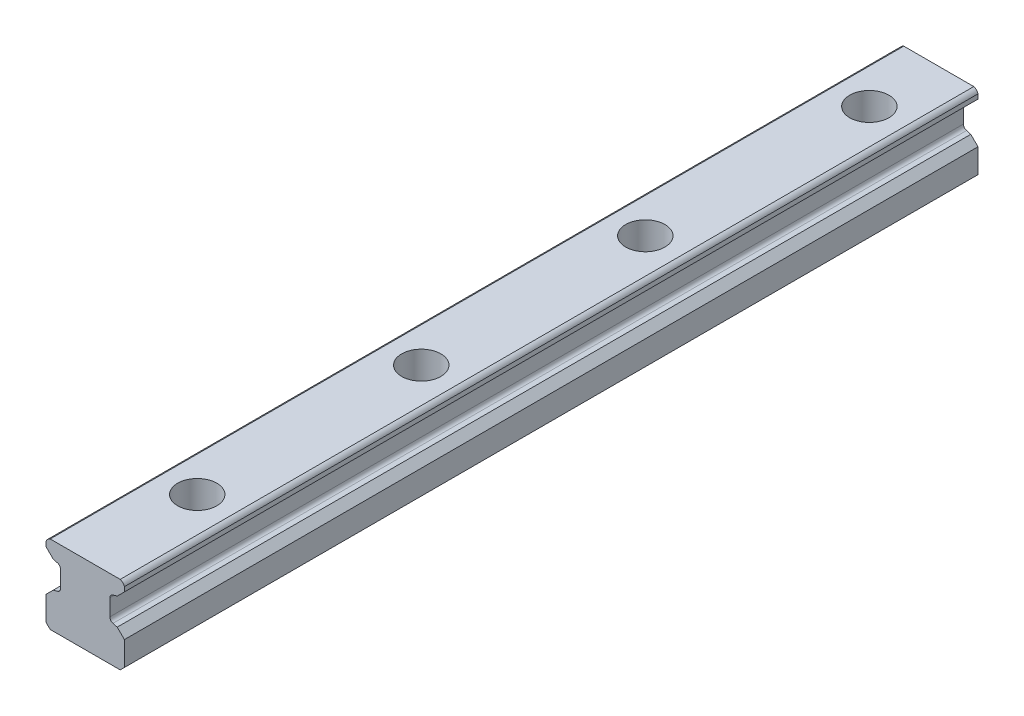
ISO-10303-21;
HEADER;
FILE_DESCRIPTION(('STEP AP214'),'2;1');
FILE_NAME('part.step','',(''),(''),'','','');
FILE_SCHEMA(('AUTOMOTIVE_DESIGN { 1 0 10303 214 1 1 1 1 }'));
ENDSEC;
DATA;
#1=APPLICATION_CONTEXT('core data for automotive mechanical design processes');
#2=APPLICATION_PROTOCOL_DEFINITION('international standard','automotive_design',2000,#1);
#3=PRODUCT_CONTEXT('',#1,'mechanical');
#4=PRODUCT('Part','Part','',(#3));
#5=PRODUCT_RELATED_PRODUCT_CATEGORY('part','',(#4));
#6=PRODUCT_DEFINITION_FORMATION('','',#4);
#7=PRODUCT_DEFINITION_CONTEXT('part definition',#1,'design');
#8=PRODUCT_DEFINITION('design','',#6,#7);
#9=PRODUCT_DEFINITION_SHAPE('','',#8);
#10=(LENGTH_UNIT() NAMED_UNIT(*) SI_UNIT(.MILLI.,.METRE.));
#11=(NAMED_UNIT(*) PLANE_ANGLE_UNIT() SI_UNIT($,.RADIAN.));
#12=(NAMED_UNIT(*) SI_UNIT($,.STERADIAN.) SOLID_ANGLE_UNIT());
#13=UNCERTAINTY_MEASURE_WITH_UNIT(LENGTH_MEASURE(1.E-05),#10,'distance_accuracy_value','');
#14=(GEOMETRIC_REPRESENTATION_CONTEXT(3) GLOBAL_UNCERTAINTY_ASSIGNED_CONTEXT((#13)) GLOBAL_UNIT_ASSIGNED_CONTEXT((#10,
#11,#12)) REPRESENTATION_CONTEXT('',''));
#15=CARTESIAN_POINT('',(0.,0.,0.));
#16=DIRECTION('',(0.,0.,1.));
#17=DIRECTION('',(1.,0.,0.));
#18=AXIS2_PLACEMENT_3D('',#15,#16,#17);
#19=CARTESIAN_POINT('',(-12.5,0.,760.));
#20=DIRECTION('',(0.,1.,0.));
#21=DIRECTION('',(-1.,0.,0.));
#22=AXIS2_PLACEMENT_3D('',#19,#20,#21);
#23=PLANE('',#22);
#24=CARTESIAN_POINT('',(0.,0.,480.));
#25=DIRECTION('',(0.,1.,0.));
#26=DIRECTION('',(0.,0.,1.));
#27=AXIS2_PLACEMENT_3D('',#24,#25,#26);
#28=CIRCLE('',#27,4.49999999999995);
#29=CARTESIAN_POINT('',(0.,0.,484.5));
#30=VERTEX_POINT('',#29);
#31=EDGE_CURVE('E324',#30,#30,#28,.T.);
#32=ORIENTED_EDGE('',*,*,#31,.T.);
#33=EDGE_LOOP('',(#32));
#34=FACE_BOUND('',#33,.T.);
#35=CARTESIAN_POINT('',(0.,0.,560.));
#36=DIRECTION('',(0.,1.,0.));
#37=DIRECTION('',(0.,0.,1.));
#38=AXIS2_PLACEMENT_3D('',#35,#36,#37);
#39=CIRCLE('',#38,4.49999999999995);
#40=CARTESIAN_POINT('',(0.,0.,564.5));
#41=VERTEX_POINT('',#40);
#42=EDGE_CURVE('E336',#41,#41,#39,.T.);
#43=ORIENTED_EDGE('',*,*,#42,.T.);
#44=EDGE_LOOP('',(#43));
#45=FACE_BOUND('',#44,.T.);
#46=CARTESIAN_POINT('',(0.,0.,640.));
#47=DIRECTION('',(0.,1.,0.));
#48=DIRECTION('',(0.,0.,1.));
#49=AXIS2_PLACEMENT_3D('',#46,#47,#48);
#50=CIRCLE('',#49,4.49999999999995);
#51=CARTESIAN_POINT('',(0.,0.,644.5));
#52=VERTEX_POINT('',#51);
#53=EDGE_CURVE('E348',#52,#52,#50,.T.);
#54=ORIENTED_EDGE('',*,*,#53,.T.);
#55=EDGE_LOOP('',(#54));
#56=FACE_BOUND('',#55,.T.);
#57=CARTESIAN_POINT('',(0.,0.,720.));
#58=DIRECTION('',(0.,1.,0.));
#59=DIRECTION('',(0.,0.,1.));
#60=AXIS2_PLACEMENT_3D('',#57,#58,#59);
#61=CIRCLE('',#60,4.49999999999995);
#62=CARTESIAN_POINT('',(0.,0.,724.5));
#63=VERTEX_POINT('',#62);
#64=EDGE_CURVE('E360',#63,#63,#61,.T.);
#65=ORIENTED_EDGE('',*,*,#64,.T.);
#66=EDGE_LOOP('',(#65));
#67=FACE_BOUND('',#66,.T.);
#68=DIRECTION('',(-1.,0.,0.));
#69=VECTOR('',#68,1.);
#70=CARTESIAN_POINT('',(-12.5,0.,455.2));
#71=LINE('',#70,#69);
#72=CARTESIAN_POINT('',(12.5,0.,455.2));
#73=VERTEX_POINT('',#72);
#74=CARTESIAN_POINT('',(-12.5,0.,455.2));
#75=VERTEX_POINT('',#74);
#76=EDGE_CURVE('E316',#73,#75,#71,.T.);
#77=ORIENTED_EDGE('',*,*,#76,.F.);
#78=DIRECTION('',(0.,0.,-1.));
#79=VECTOR('',#78,1.);
#80=CARTESIAN_POINT('',(12.5,0.,760.));
#81=LINE('',#80,#79);
#82=CARTESIAN_POINT('',(12.5,0.,760.));
#83=VERTEX_POINT('',#82);
#84=EDGE_CURVE('E260',#83,#73,#81,.T.);
#85=ORIENTED_EDGE('',*,*,#84,.F.);
#86=DIRECTION('',(1.,0.,0.));
#87=VECTOR('',#86,1.);
#88=CARTESIAN_POINT('',(-12.5,0.,760.));
#89=LINE('',#88,#87);
#90=CARTESIAN_POINT('',(-12.5,0.,760.));
#91=VERTEX_POINT('',#90);
#92=EDGE_CURVE('E380',#91,#83,#89,.T.);
#93=ORIENTED_EDGE('',*,*,#92,.F.);
#94=DIRECTION('',(0.,0.,-1.));
#95=VECTOR('',#94,1.);
#96=CARTESIAN_POINT('',(-12.5,0.,760.));
#97=LINE('',#96,#95);
#98=EDGE_CURVE('E263',#91,#75,#97,.T.);
#99=ORIENTED_EDGE('',*,*,#98,.T.);
#100=EDGE_LOOP('',(#77,#85,#93,#99));
#101=FACE_BOUND('',#100,.T.);
#102=ADVANCED_FACE('F33',(#34,#45,#56,#67,#101),#23,.F.);
#103=CARTESIAN_POINT('',(12.5,28.,760.));
#104=DIRECTION('',(0.,-1.,0.));
#105=DIRECTION('',(1.,0.,0.));
#106=AXIS2_PLACEMENT_3D('',#103,#104,#105);
#107=PLANE('',#106);
#108=CARTESIAN_POINT('',(0.,28.,480.));
#109=DIRECTION('',(0.,1.,0.));
#110=DIRECTION('',(0.,0.,1.));
#111=AXIS2_PLACEMENT_3D('',#108,#109,#110);
#112=CIRCLE('',#111,7.00000000000001);
#113=CARTESIAN_POINT('',(0.,28.,487.));
#114=VERTEX_POINT('',#113);
#115=EDGE_CURVE('E333',#114,#114,#112,.T.);
#116=ORIENTED_EDGE('',*,*,#115,.F.);
#117=EDGE_LOOP('',(#116));
#118=FACE_BOUND('',#117,.T.);
#119=CARTESIAN_POINT('',(0.,28.,560.));
#120=DIRECTION('',(0.,1.,0.));
#121=DIRECTION('',(0.,0.,1.));
#122=AXIS2_PLACEMENT_3D('',#119,#120,#121);
#123=CIRCLE('',#122,7.00000000000001);
#124=CARTESIAN_POINT('',(0.,28.,567.));
#125=VERTEX_POINT('',#124);
#126=EDGE_CURVE('E345',#125,#125,#123,.T.);
#127=ORIENTED_EDGE('',*,*,#126,.F.);
#128=EDGE_LOOP('',(#127));
#129=FACE_BOUND('',#128,.T.);
#130=CARTESIAN_POINT('',(0.,28.,640.));
#131=DIRECTION('',(0.,1.,0.));
#132=DIRECTION('',(0.,0.,1.));
#133=AXIS2_PLACEMENT_3D('',#130,#131,#132);
#134=CIRCLE('',#133,7.00000000000001);
#135=CARTESIAN_POINT('',(0.,28.,647.));
#136=VERTEX_POINT('',#135);
#137=EDGE_CURVE('E357',#136,#136,#134,.T.);
#138=ORIENTED_EDGE('',*,*,#137,.F.);
#139=EDGE_LOOP('',(#138));
#140=FACE_BOUND('',#139,.T.);
#141=CARTESIAN_POINT('',(0.,28.,720.));
#142=DIRECTION('',(0.,1.,0.));
#143=DIRECTION('',(0.,0.,1.));
#144=AXIS2_PLACEMENT_3D('',#141,#142,#143);
#145=CIRCLE('',#144,7.00000000000001);
#146=CARTESIAN_POINT('',(0.,28.,727.));
#147=VERTEX_POINT('',#146);
#148=EDGE_CURVE('E369',#147,#147,#145,.T.);
#149=ORIENTED_EDGE('',*,*,#148,.F.);
#150=EDGE_LOOP('',(#149));
#151=FACE_BOUND('',#150,.T.);
#152=DIRECTION('',(1.,0.,0.));
#153=VECTOR('',#152,1.);
#154=CARTESIAN_POINT('',(12.5,28.,455.2));
#155=LINE('',#154,#153);
#156=CARTESIAN_POINT('',(-12.5,28.,455.2));
#157=VERTEX_POINT('',#156);
#158=CARTESIAN_POINT('',(12.5,28.,455.2));
#159=VERTEX_POINT('',#158);
#160=EDGE_CURVE('E285',#157,#159,#155,.T.);
#161=ORIENTED_EDGE('',*,*,#160,.F.);
#162=DIRECTION('',(0.,0.,-1.));
#163=VECTOR('',#162,1.);
#164=CARTESIAN_POINT('',(-12.5,28.,760.));
#165=LINE('',#164,#163);
#166=CARTESIAN_POINT('',(-12.5,28.,760.));
#167=VERTEX_POINT('',#166);
#168=EDGE_CURVE('E224',#167,#157,#165,.T.);
#169=ORIENTED_EDGE('',*,*,#168,.F.);
#170=DIRECTION('',(-1.,0.,0.));
#171=VECTOR('',#170,1.);
#172=CARTESIAN_POINT('',(12.5,28.,760.));
#173=LINE('',#172,#171);
#174=CARTESIAN_POINT('',(12.5,28.,760.));
#175=VERTEX_POINT('',#174);
#176=EDGE_CURVE('E404',#175,#167,#173,.T.);
#177=ORIENTED_EDGE('',*,*,#176,.F.);
#178=DIRECTION('',(0.,0.,-1.));
#179=VECTOR('',#178,1.);
#180=CARTESIAN_POINT('',(12.5,28.,760.));
#181=LINE('',#180,#179);
#182=EDGE_CURVE('E227',#175,#159,#181,.T.);
#183=ORIENTED_EDGE('',*,*,#182,.T.);
#184=EDGE_LOOP('',(#161,#169,#177,#183));
#185=FACE_BOUND('',#184,.T.);
#186=ADVANCED_FACE('F441',(#118,#129,#140,#151,#185),#107,.F.);
#187=CARTESIAN_POINT('',(-10.3,14.5556968580623,760.));
#188=DIRECTION('',(0.,0.,-1.));
#189=DIRECTION('',(-1.,0.,0.));
#190=AXIS2_PLACEMENT_3D('',#187,#188,#189);
#191=CYLINDRICAL_SURFACE('',#190,1.5);
#192=CARTESIAN_POINT('',(-10.3,14.5556968580623,455.2));
#193=DIRECTION('',(0.,0.,-1.));
#194=DIRECTION('',(-1.,0.,0.));
#195=AXIS2_PLACEMENT_3D('',#192,#193,#194);
#196=CIRCLE('',#195,1.5);
#197=CARTESIAN_POINT('',(-9.91177143234622,13.1068081186287,455.2));
#198=VERTEX_POINT('',#197);
#199=CARTESIAN_POINT('',(-8.8,14.5556968580623,455.2));
#200=VERTEX_POINT('',#199);
#201=EDGE_CURVE('E47',#198,#200,#196,.F.);
#202=ORIENTED_EDGE('',*,*,#201,.F.);
#203=DIRECTION('',(0.,0.,-1.));
#204=VECTOR('',#203,1.);
#205=CARTESIAN_POINT('',(-9.91177143234622,13.1068081186287,760.));
#206=LINE('',#205,#204);
#207=CARTESIAN_POINT('',(-9.91177143234622,13.1068081186287,760.));
#208=VERTEX_POINT('',#207);
#209=EDGE_CURVE('E41',#208,#198,#206,.T.);
#210=ORIENTED_EDGE('',*,*,#209,.F.);
#211=CARTESIAN_POINT('',(-10.3,14.5556968580623,760.));
#212=DIRECTION('',(0.,0.,-1.));
#213=DIRECTION('',(1.,0.,0.));
#214=AXIS2_PLACEMENT_3D('',#211,#212,#213);
#215=CIRCLE('',#214,1.5);
#216=CARTESIAN_POINT('',(-8.8,14.5556968580623,760.));
#217=VERTEX_POINT('',#216);
#218=EDGE_CURVE('E284',#217,#208,#215,.T.);
#219=ORIENTED_EDGE('',*,*,#218,.F.);
#220=DIRECTION('',(0.,0.,-1.));
#221=VECTOR('',#220,1.);
#222=CARTESIAN_POINT('',(-8.8,14.5556968580623,760.));
#223=LINE('',#222,#221);
#224=EDGE_CURVE('E209',#217,#200,#223,.T.);
#225=ORIENTED_EDGE('',*,*,#224,.T.);
#226=EDGE_LOOP('',(#202,#210,#219,#225));
#227=FACE_BOUND('',#226,.T.);
#228=ADVANCED_FACE('F35',(#227),#191,.F.);
#229=CARTESIAN_POINT('',(-9.91177143234622,13.1068081186287,760.));
#230=DIRECTION('',(0.258819045102522,-0.965925826289068,0.));
#231=DIRECTION('',(0.965925826289068,0.258819045102522,0.));
#232=AXIS2_PLACEMENT_3D('',#229,#230,#231);
#233=PLANE('',#232);
#234=DIRECTION('',(0.965925826289068,0.258819045102522,0.));
#235=VECTOR('',#234,1.);
#236=CARTESIAN_POINT('',(-9.91177143234622,13.1068081186287,455.2));
#237=LINE('',#236,#235);
#238=CARTESIAN_POINT('',(-11.43,12.7,455.2));
#239=VERTEX_POINT('',#238);
#240=EDGE_CURVE('E280',#239,#198,#237,.T.);
#241=ORIENTED_EDGE('',*,*,#240,.F.);
#242=DIRECTION('',(0.,0.,-1.));
#243=VECTOR('',#242,1.);
#244=CARTESIAN_POINT('',(-11.43,12.7,760.));
#245=LINE('',#244,#243);
#246=CARTESIAN_POINT('',(-11.43,12.7,760.));
#247=VERTEX_POINT('',#246);
#248=EDGE_CURVE('E272',#247,#239,#245,.T.);
#249=ORIENTED_EDGE('',*,*,#248,.F.);
#250=DIRECTION('',(-0.965925826289068,-0.258819045102522,0.));
#251=VECTOR('',#250,1.);
#252=CARTESIAN_POINT('',(-9.91177143234622,13.1068081186287,760.));
#253=LINE('',#252,#251);
#254=EDGE_CURVE('E281',#208,#247,#253,.T.);
#255=ORIENTED_EDGE('',*,*,#254,.F.);
#256=ORIENTED_EDGE('',*,*,#209,.T.);
#257=EDGE_LOOP('',(#241,#249,#255,#256));
#258=FACE_BOUND('',#257,.T.);
#259=ADVANCED_FACE('F278',(#258),#233,.F.);
#260=CARTESIAN_POINT('',(-11.43,12.7,760.));
#261=DIRECTION('',(0.707106781186549,-0.707106781186546,0.));
#262=DIRECTION('',(0.707106781186546,0.707106781186549,0.));
#263=AXIS2_PLACEMENT_3D('',#260,#261,#262);
#264=PLANE('',#263);
#265=DIRECTION('',(0.707106781186546,0.707106781186549,0.));
#266=VECTOR('',#265,1.);
#267=CARTESIAN_POINT('',(-11.43,12.7,455.2));
#268=LINE('',#267,#266);
#269=CARTESIAN_POINT('',(-14.,10.13,455.2));
#270=VERTEX_POINT('',#269);
#271=EDGE_CURVE('E322',#270,#239,#268,.T.);
#272=ORIENTED_EDGE('',*,*,#271,.F.);
#273=DIRECTION('',(0.,0.,-1.));
#274=VECTOR('',#273,1.);
#275=CARTESIAN_POINT('',(-14.,10.13,760.));
#276=LINE('',#275,#274);
#277=CARTESIAN_POINT('',(-14.,10.13,760.));
#278=VERTEX_POINT('',#277);
#279=EDGE_CURVE('E269',#278,#270,#276,.T.);
#280=ORIENTED_EDGE('',*,*,#279,.F.);
#281=DIRECTION('',(-0.707106781186546,-0.707106781186549,0.));
#282=VECTOR('',#281,1.);
#283=CARTESIAN_POINT('',(-11.43,12.7,760.));
#284=LINE('',#283,#282);
#285=EDGE_CURVE('E374',#247,#278,#284,.T.);
#286=ORIENTED_EDGE('',*,*,#285,.F.);
#287=ORIENTED_EDGE('',*,*,#248,.T.);
#288=EDGE_LOOP('',(#272,#280,#286,#287));
#289=FACE_BOUND('',#288,.T.);
#290=ADVANCED_FACE('F512',(#289),#264,.F.);
#291=CARTESIAN_POINT('',(-14.,10.13,760.));
#292=DIRECTION('',(1.,0.,0.));
#293=DIRECTION('',(0.,1.,0.));
#294=AXIS2_PLACEMENT_3D('',#291,#292,#293);
#295=PLANE('',#294);
#296=DIRECTION('',(0.,1.,0.));
#297=VECTOR('',#296,1.);
#298=CARTESIAN_POINT('',(-14.,10.13,455.2));
#299=LINE('',#298,#297);
#300=CARTESIAN_POINT('',(-14.,1.5,455.2));
#301=VERTEX_POINT('',#300);
#302=EDGE_CURVE('E320',#301,#270,#299,.T.);
#303=ORIENTED_EDGE('',*,*,#302,.F.);
#304=DIRECTION('',(0.,0.,-1.));
#305=VECTOR('',#304,1.);
#306=CARTESIAN_POINT('',(-14.,1.5,760.));
#307=LINE('',#306,#305);
#308=CARTESIAN_POINT('',(-14.,1.5,760.));
#309=VERTEX_POINT('',#308);
#310=EDGE_CURVE('E266',#309,#301,#307,.T.);
#311=ORIENTED_EDGE('',*,*,#310,.F.);
#312=DIRECTION('',(0.,-1.,0.));
#313=VECTOR('',#312,1.);
#314=CARTESIAN_POINT('',(-14.,10.13,760.));
#315=LINE('',#314,#313);
#316=EDGE_CURVE('E376',#278,#309,#315,.T.);
#317=ORIENTED_EDGE('',*,*,#316,.F.);
#318=ORIENTED_EDGE('',*,*,#279,.T.);
#319=EDGE_LOOP('',(#303,#311,#317,#318));
#320=FACE_BOUND('',#319,.T.);
#321=ADVANCED_FACE('F508',(#320),#295,.F.);
#322=CARTESIAN_POINT('',(-14.,1.5,760.));
#323=DIRECTION('',(0.707106781186547,0.707106781186548,0.));
#324=DIRECTION('',(-0.707106781186548,0.707106781186547,0.));
#325=AXIS2_PLACEMENT_3D('',#322,#323,#324);
#326=PLANE('',#325);
#327=DIRECTION('',(-0.707106781186548,0.707106781186547,0.));
#328=VECTOR('',#327,1.);
#329=CARTESIAN_POINT('',(-14.,1.5,455.2));
#330=LINE('',#329,#328);
#331=EDGE_CURVE('E318',#75,#301,#330,.T.);
#332=ORIENTED_EDGE('',*,*,#331,.F.);
#333=ORIENTED_EDGE('',*,*,#98,.F.);
#334=DIRECTION('',(0.707106781186548,-0.707106781186547,0.));
#335=VECTOR('',#334,1.);
#336=CARTESIAN_POINT('',(-14.,1.5,760.));
#337=LINE('',#336,#335);
#338=EDGE_CURVE('E378',#309,#91,#337,.T.);
#339=ORIENTED_EDGE('',*,*,#338,.F.);
#340=ORIENTED_EDGE('',*,*,#310,.T.);
#341=EDGE_LOOP('',(#332,#333,#339,#340));
#342=FACE_BOUND('',#341,.T.);
#343=ADVANCED_FACE('F503',(#342),#326,.F.);
#344=CARTESIAN_POINT('',(12.5,0.,760.));
#345=DIRECTION('',(-0.707106781186548,0.707106781186547,0.));
#346=DIRECTION('',(-0.707106781186547,-0.707106781186548,0.));
#347=AXIS2_PLACEMENT_3D('',#344,#345,#346);
#348=PLANE('',#347);
#349=DIRECTION('',(-0.707106781186547,-0.707106781186548,0.));
#350=VECTOR('',#349,1.);
#351=CARTESIAN_POINT('',(12.5,0.,455.2));
#352=LINE('',#351,#350);
#353=CARTESIAN_POINT('',(14.,1.5,455.2));
#354=VERTEX_POINT('',#353);
#355=EDGE_CURVE('E313',#354,#73,#352,.T.);
#356=ORIENTED_EDGE('',*,*,#355,.F.);
#357=DIRECTION('',(0.,0.,-1.));
#358=VECTOR('',#357,1.);
#359=CARTESIAN_POINT('',(14.,1.5,760.));
#360=LINE('',#359,#358);
#361=CARTESIAN_POINT('',(14.,1.5,760.));
#362=VERTEX_POINT('',#361);
#363=EDGE_CURVE('E257',#362,#354,#360,.T.);
#364=ORIENTED_EDGE('',*,*,#363,.F.);
#365=DIRECTION('',(0.707106781186547,0.707106781186548,0.));
#366=VECTOR('',#365,1.);
#367=CARTESIAN_POINT('',(12.5,0.,760.));
#368=LINE('',#367,#366);
#369=EDGE_CURVE('E382',#83,#362,#368,.T.);
#370=ORIENTED_EDGE('',*,*,#369,.F.);
#371=ORIENTED_EDGE('',*,*,#84,.T.);
#372=EDGE_LOOP('',(#356,#364,#370,#371));
#373=FACE_BOUND('',#372,.T.);
#374=ADVANCED_FACE('F494',(#373),#348,.F.);
#375=CARTESIAN_POINT('',(14.,1.5,760.));
#376=DIRECTION('',(-1.,0.,0.));
#377=DIRECTION('',(0.,-1.,0.));
#378=AXIS2_PLACEMENT_3D('',#375,#376,#377);
#379=PLANE('',#378);
#380=DIRECTION('',(0.,-1.,0.));
#381=VECTOR('',#380,1.);
#382=CARTESIAN_POINT('',(14.,1.5,455.2));
#383=LINE('',#382,#381);
#384=CARTESIAN_POINT('',(14.,10.13,455.2));
#385=VERTEX_POINT('',#384);
#386=EDGE_CURVE('E311',#385,#354,#383,.T.);
#387=ORIENTED_EDGE('',*,*,#386,.F.);
#388=DIRECTION('',(0.,0.,-1.));
#389=VECTOR('',#388,1.);
#390=CARTESIAN_POINT('',(14.,10.13,760.));
#391=LINE('',#390,#389);
#392=CARTESIAN_POINT('',(14.,10.13,760.));
#393=VERTEX_POINT('',#392);
#394=EDGE_CURVE('E254',#393,#385,#391,.T.);
#395=ORIENTED_EDGE('',*,*,#394,.F.);
#396=DIRECTION('',(0.,1.,0.));
#397=VECTOR('',#396,1.);
#398=CARTESIAN_POINT('',(14.,1.5,760.));
#399=LINE('',#398,#397);
#400=EDGE_CURVE('E384',#362,#393,#399,.T.);
#401=ORIENTED_EDGE('',*,*,#400,.F.);
#402=ORIENTED_EDGE('',*,*,#363,.T.);
#403=EDGE_LOOP('',(#387,#395,#401,#402));
#404=FACE_BOUND('',#403,.T.);
#405=ADVANCED_FACE('F489',(#404),#379,.F.);
#406=CARTESIAN_POINT('',(14.,10.13,760.));
#407=DIRECTION('',(-0.707106781186548,-0.707106781186548,0.));
#408=DIRECTION('',(0.707106781186548,-0.707106781186548,0.));
#409=AXIS2_PLACEMENT_3D('',#406,#407,#408);
#410=PLANE('',#409);
#411=DIRECTION('',(0.707106781186548,-0.707106781186548,0.));
#412=VECTOR('',#411,1.);
#413=CARTESIAN_POINT('',(14.,10.13,455.2));
#414=LINE('',#413,#412);
#415=CARTESIAN_POINT('',(11.43,12.7,455.2));
#416=VERTEX_POINT('',#415);
#417=EDGE_CURVE('E309',#416,#385,#414,.T.);
#418=ORIENTED_EDGE('',*,*,#417,.F.);
#419=DIRECTION('',(0.,0.,-1.));
#420=VECTOR('',#419,1.);
#421=CARTESIAN_POINT('',(11.43,12.7,760.));
#422=LINE('',#421,#420);
#423=CARTESIAN_POINT('',(11.43,12.7,760.));
#424=VERTEX_POINT('',#423);
#425=EDGE_CURVE('E251',#424,#416,#422,.T.);
#426=ORIENTED_EDGE('',*,*,#425,.F.);
#427=DIRECTION('',(-0.707106781186548,0.707106781186548,0.));
#428=VECTOR('',#427,1.);
#429=CARTESIAN_POINT('',(14.,10.13,760.));
#430=LINE('',#429,#428);
#431=EDGE_CURVE('E386',#393,#424,#430,.T.);
#432=ORIENTED_EDGE('',*,*,#431,.F.);
#433=ORIENTED_EDGE('',*,*,#394,.T.);
#434=EDGE_LOOP('',(#418,#426,#432,#433));
#435=FACE_BOUND('',#434,.T.);
#436=ADVANCED_FACE('F484',(#435),#410,.F.);
#437=CARTESIAN_POINT('',(11.43,12.7,760.));
#438=DIRECTION('',(-0.258819045102522,-0.965925826289068,0.));
#439=DIRECTION('',(0.965925826289068,-0.258819045102522,0.));
#440=AXIS2_PLACEMENT_3D('',#437,#438,#439);
#441=PLANE('',#440);
#442=DIRECTION('',(0.965925826289068,-0.258819045102522,0.));
#443=VECTOR('',#442,1.);
#444=CARTESIAN_POINT('',(11.43,12.7,455.2));
#445=LINE('',#444,#443);
#446=CARTESIAN_POINT('',(9.91177143234622,13.1068081186287,455.2));
#447=VERTEX_POINT('',#446);
#448=EDGE_CURVE('E307',#447,#416,#445,.T.);
#449=ORIENTED_EDGE('',*,*,#448,.F.);
#450=DIRECTION('',(0.,0.,-1.));
#451=VECTOR('',#450,1.);
#452=CARTESIAN_POINT('',(9.91177143234622,13.1068081186287,760.));
#453=LINE('',#452,#451);
#454=CARTESIAN_POINT('',(9.91177143234622,13.1068081186287,760.));
#455=VERTEX_POINT('',#454);
#456=EDGE_CURVE('E248',#455,#447,#453,.T.);
#457=ORIENTED_EDGE('',*,*,#456,.F.);
#458=DIRECTION('',(-0.965925826289068,0.258819045102522,0.));
#459=VECTOR('',#458,1.);
#460=CARTESIAN_POINT('',(11.43,12.7,760.));
#461=LINE('',#460,#459);
#462=EDGE_CURVE('E388',#424,#455,#461,.T.);
#463=ORIENTED_EDGE('',*,*,#462,.F.);
#464=ORIENTED_EDGE('',*,*,#425,.T.);
#465=EDGE_LOOP('',(#449,#457,#463,#464));
#466=FACE_BOUND('',#465,.T.);
#467=ADVANCED_FACE('F479',(#466),#441,.F.);
#468=CARTESIAN_POINT('',(10.3,14.5556968580623,760.));
#469=DIRECTION('',(0.,0.,-1.));
#470=DIRECTION('',(-1.,0.,0.));
#471=AXIS2_PLACEMENT_3D('',#468,#469,#470);
#472=CYLINDRICAL_SURFACE('',#471,1.5);
#473=CARTESIAN_POINT('',(10.3,14.5556968580623,455.2));
#474=DIRECTION('',(0.,0.,-1.));
#475=DIRECTION('',(-1.,0.,0.));
#476=AXIS2_PLACEMENT_3D('',#473,#474,#475);
#477=CIRCLE('',#476,1.5);
#478=CARTESIAN_POINT('',(8.8,14.5556968580623,455.2));
#479=VERTEX_POINT('',#478);
#480=EDGE_CURVE('E305',#479,#447,#477,.F.);
#481=ORIENTED_EDGE('',*,*,#480,.F.);
#482=DIRECTION('',(0.,0.,-1.));
#483=VECTOR('',#482,1.);
#484=CARTESIAN_POINT('',(8.8,14.5556968580623,760.));
#485=LINE('',#484,#483);
#486=CARTESIAN_POINT('',(8.8,14.5556968580623,760.));
#487=VERTEX_POINT('',#486);
#488=EDGE_CURVE('E245',#487,#479,#485,.T.);
#489=ORIENTED_EDGE('',*,*,#488,.F.);
#490=CARTESIAN_POINT('',(10.3,14.5556968580623,760.));
#491=DIRECTION('',(0.,0.,-1.));
#492=DIRECTION('',(1.,0.,0.));
#493=AXIS2_PLACEMENT_3D('',#490,#491,#492);
#494=CIRCLE('',#493,1.5);
#495=EDGE_CURVE('E390',#455,#487,#494,.T.);
#496=ORIENTED_EDGE('',*,*,#495,.F.);
#497=ORIENTED_EDGE('',*,*,#456,.T.);
#498=EDGE_LOOP('',(#481,#489,#496,#497));
#499=FACE_BOUND('',#498,.T.);
#500=ADVANCED_FACE('F474',(#499),#472,.F.);
#501=CARTESIAN_POINT('',(8.8,14.5556968580623,760.));
#502=DIRECTION('',(-1.,0.,0.));
#503=DIRECTION('',(0.,-1.,0.));
#504=AXIS2_PLACEMENT_3D('',#501,#502,#503);
#505=PLANE('',#504);
#506=DIRECTION('',(0.,-1.,0.));
#507=VECTOR('',#506,1.);
#508=CARTESIAN_POINT('',(8.8,14.5556968580623,455.2));
#509=LINE('',#508,#507);
#510=CARTESIAN_POINT('',(8.8,20.4443031419377,455.2));
#511=VERTEX_POINT('',#510);
#512=EDGE_CURVE('E303',#511,#479,#509,.T.);
#513=ORIENTED_EDGE('',*,*,#512,.F.);
#514=DIRECTION('',(0.,0.,-1.));
#515=VECTOR('',#514,1.);
#516=CARTESIAN_POINT('',(8.8,20.4443031419377,760.));
#517=LINE('',#516,#515);
#518=CARTESIAN_POINT('',(8.8,20.4443031419377,760.));
#519=VERTEX_POINT('',#518);
#520=EDGE_CURVE('E242',#519,#511,#517,.T.);
#521=ORIENTED_EDGE('',*,*,#520,.F.);
#522=DIRECTION('',(0.,1.,0.));
#523=VECTOR('',#522,1.);
#524=CARTESIAN_POINT('',(8.8,14.5556968580623,760.));
#525=LINE('',#524,#523);
#526=EDGE_CURVE('E392',#487,#519,#525,.T.);
#527=ORIENTED_EDGE('',*,*,#526,.F.);
#528=ORIENTED_EDGE('',*,*,#488,.T.);
#529=EDGE_LOOP('',(#513,#521,#527,#528));
#530=FACE_BOUND('',#529,.T.);
#531=ADVANCED_FACE('F469',(#530),#505,.F.);
#532=CARTESIAN_POINT('',(10.3,20.4443031419377,760.));
#533=DIRECTION('',(0.,0.,-1.));
#534=DIRECTION('',(-1.,0.,0.));
#535=AXIS2_PLACEMENT_3D('',#532,#533,#534);
#536=CYLINDRICAL_SURFACE('',#535,1.5);
#537=CARTESIAN_POINT('',(10.3,20.4443031419377,455.2));
#538=DIRECTION('',(0.,0.,-1.));
#539=DIRECTION('',(-1.,0.,0.));
#540=AXIS2_PLACEMENT_3D('',#537,#538,#539);
#541=CIRCLE('',#540,1.5);
#542=CARTESIAN_POINT('',(9.91177143234622,21.8931918813713,455.2));
#543=VERTEX_POINT('',#542);
#544=EDGE_CURVE('E301',#543,#511,#541,.F.);
#545=ORIENTED_EDGE('',*,*,#544,.F.);
#546=DIRECTION('',(0.,0.,-1.));
#547=VECTOR('',#546,1.);
#548=CARTESIAN_POINT('',(9.91177143234622,21.8931918813713,760.));
#549=LINE('',#548,#547);
#550=CARTESIAN_POINT('',(9.91177143234622,21.8931918813713,760.));
#551=VERTEX_POINT('',#550);
#552=EDGE_CURVE('E239',#551,#543,#549,.T.);
#553=ORIENTED_EDGE('',*,*,#552,.F.);
#554=CARTESIAN_POINT('',(10.3,20.4443031419377,760.));
#555=DIRECTION('',(0.,0.,-1.));
#556=DIRECTION('',(1.,0.,0.));
#557=AXIS2_PLACEMENT_3D('',#554,#555,#556);
#558=CIRCLE('',#557,1.5);
#559=EDGE_CURVE('E394',#519,#551,#558,.T.);
#560=ORIENTED_EDGE('',*,*,#559,.F.);
#561=ORIENTED_EDGE('',*,*,#520,.T.);
#562=EDGE_LOOP('',(#545,#553,#560,#561));
#563=FACE_BOUND('',#562,.T.);
#564=ADVANCED_FACE('F464',(#563),#536,.F.);
#565=CARTESIAN_POINT('',(9.91177143234622,21.8931918813713,760.));
#566=DIRECTION('',(-0.258819045102524,0.965925826289067,0.));
#567=DIRECTION('',(-0.965925826289068,-0.258819045102524,0.));
#568=AXIS2_PLACEMENT_3D('',#565,#566,#567);
#569=PLANE('',#568);
#570=DIRECTION('',(-0.965925826289068,-0.258819045102524,0.));
#571=VECTOR('',#570,1.);
#572=CARTESIAN_POINT('',(9.91177143234622,21.8931918813713,455.2));
#573=LINE('',#572,#571);
#574=CARTESIAN_POINT('',(11.43,22.3,455.2));
#575=VERTEX_POINT('',#574);
#576=EDGE_CURVE('E299',#575,#543,#573,.T.);
#577=ORIENTED_EDGE('',*,*,#576,.F.);
#578=DIRECTION('',(0.,0.,-1.));
#579=VECTOR('',#578,1.);
#580=CARTESIAN_POINT('',(11.43,22.3,760.));
#581=LINE('',#580,#579);
#582=CARTESIAN_POINT('',(11.43,22.3,760.));
#583=VERTEX_POINT('',#582);
#584=EDGE_CURVE('E236',#583,#575,#581,.T.);
#585=ORIENTED_EDGE('',*,*,#584,.F.);
#586=DIRECTION('',(0.965925826289067,0.258819045102524,0.));
#587=VECTOR('',#586,1.);
#588=CARTESIAN_POINT('',(9.91177143234622,21.8931918813713,760.));
#589=LINE('',#588,#587);
#590=EDGE_CURVE('E396',#551,#583,#589,.T.);
#591=ORIENTED_EDGE('',*,*,#590,.F.);
#592=ORIENTED_EDGE('',*,*,#552,.T.);
#593=EDGE_LOOP('',(#577,#585,#591,#592));
#594=FACE_BOUND('',#593,.T.);
#595=ADVANCED_FACE('F459',(#594),#569,.F.);
#596=CARTESIAN_POINT('',(11.43,22.3,760.));
#597=DIRECTION('',(-0.707106781186548,0.707106781186547,0.));
#598=DIRECTION('',(-0.707106781186547,-0.707106781186548,0.));
#599=AXIS2_PLACEMENT_3D('',#596,#597,#598);
#600=PLANE('',#599);
#601=DIRECTION('',(-0.707106781186547,-0.707106781186548,0.));
#602=VECTOR('',#601,1.);
#603=CARTESIAN_POINT('',(11.43,22.3,455.2));
#604=LINE('',#603,#602);
#605=CARTESIAN_POINT('',(14.,24.87,455.2));
#606=VERTEX_POINT('',#605);
#607=EDGE_CURVE('E297',#606,#575,#604,.T.);
#608=ORIENTED_EDGE('',*,*,#607,.F.);
#609=DIRECTION('',(0.,0.,-1.));
#610=VECTOR('',#609,1.);
#611=CARTESIAN_POINT('',(14.,24.87,760.));
#612=LINE('',#611,#610);
#613=CARTESIAN_POINT('',(14.,24.87,760.));
#614=VERTEX_POINT('',#613);
#615=EDGE_CURVE('E233',#614,#606,#612,.T.);
#616=ORIENTED_EDGE('',*,*,#615,.F.);
#617=DIRECTION('',(0.707106781186547,0.707106781186548,0.));
#618=VECTOR('',#617,1.);
#619=CARTESIAN_POINT('',(11.43,22.3,760.));
#620=LINE('',#619,#618);
#621=EDGE_CURVE('E398',#583,#614,#620,.T.);
#622=ORIENTED_EDGE('',*,*,#621,.F.);
#623=ORIENTED_EDGE('',*,*,#584,.T.);
#624=EDGE_LOOP('',(#608,#616,#622,#623));
#625=FACE_BOUND('',#624,.T.);
#626=ADVANCED_FACE('F454',(#625),#600,.F.);
#627=CARTESIAN_POINT('',(14.,24.87,760.));
#628=DIRECTION('',(-1.,0.,0.));
#629=DIRECTION('',(0.,-1.,0.));
#630=AXIS2_PLACEMENT_3D('',#627,#628,#629);
#631=PLANE('',#630);
#632=DIRECTION('',(0.,-1.,0.));
#633=VECTOR('',#632,1.);
#634=CARTESIAN_POINT('',(14.,24.87,455.2));
#635=LINE('',#634,#633);
#636=CARTESIAN_POINT('',(14.,26.5,455.2));
#637=VERTEX_POINT('',#636);
#638=EDGE_CURVE('E295',#637,#606,#635,.T.);
#639=ORIENTED_EDGE('',*,*,#638,.F.);
#640=DIRECTION('',(0.,0.,-1.));
#641=VECTOR('',#640,1.);
#642=CARTESIAN_POINT('',(14.,26.5,760.));
#643=LINE('',#642,#641);
#644=CARTESIAN_POINT('',(14.,26.5,760.));
#645=VERTEX_POINT('',#644);
#646=EDGE_CURVE('E230',#645,#637,#643,.T.);
#647=ORIENTED_EDGE('',*,*,#646,.F.);
#648=DIRECTION('',(0.,1.,0.));
#649=VECTOR('',#648,1.);
#650=CARTESIAN_POINT('',(14.,24.87,760.));
#651=LINE('',#650,#649);
#652=EDGE_CURVE('E400',#614,#645,#651,.T.);
#653=ORIENTED_EDGE('',*,*,#652,.F.);
#654=ORIENTED_EDGE('',*,*,#615,.T.);
#655=EDGE_LOOP('',(#639,#647,#653,#654));
#656=FACE_BOUND('',#655,.T.);
#657=ADVANCED_FACE('F449',(#656),#631,.F.);
#658=CARTESIAN_POINT('',(11.6492189406418,25.6492189406418,760.));
#659=DIRECTION('',(0.,0.,-1.));
#660=DIRECTION('',(-1.,0.,0.));
#661=AXIS2_PLACEMENT_3D('',#658,#659,#660);
#662=CYLINDRICAL_SURFACE('',#661,2.5);
#663=CARTESIAN_POINT('',(11.6492189406418,25.6492189406418,455.2));
#664=DIRECTION('',(0.,0.,-1.));
#665=DIRECTION('',(-1.,0.,0.));
#666=AXIS2_PLACEMENT_3D('',#663,#664,#665);
#667=CIRCLE('',#666,2.5);
#668=EDGE_CURVE('E288',#159,#637,#667,.T.);
#669=ORIENTED_EDGE('',*,*,#668,.F.);
#670=ORIENTED_EDGE('',*,*,#182,.F.);
#671=CARTESIAN_POINT('',(11.6492189406418,25.6492189406418,760.));
#672=DIRECTION('',(0.,0.,1.));
#673=DIRECTION('',(1.,0.,0.));
#674=AXIS2_PLACEMENT_3D('',#671,#672,#673);
#675=CIRCLE('',#674,2.5);
#676=EDGE_CURVE('E402',#645,#175,#675,.T.);
#677=ORIENTED_EDGE('',*,*,#676,.F.);
#678=ORIENTED_EDGE('',*,*,#646,.T.);
#679=EDGE_LOOP('',(#669,#670,#677,#678));
#680=FACE_BOUND('',#679,.T.);
#681=ADVANCED_FACE('F445',(#680),#662,.T.);
#682=CARTESIAN_POINT('',(-11.6492189406418,25.6492189406418,760.));
#683=DIRECTION('',(0.,0.,-1.));
#684=DIRECTION('',(-1.,0.,0.));
#685=AXIS2_PLACEMENT_3D('',#682,#683,#684);
#686=CYLINDRICAL_SURFACE('',#685,2.5);
#687=CARTESIAN_POINT('',(-11.6492189406418,25.6492189406418,455.2));
#688=DIRECTION('',(0.,0.,-1.));
#689=DIRECTION('',(-1.,0.,0.));
#690=AXIS2_PLACEMENT_3D('',#687,#688,#689);
#691=CIRCLE('',#690,2.5);
#692=CARTESIAN_POINT('',(-14.,26.5,455.2));
#693=VERTEX_POINT('',#692);
#694=EDGE_CURVE('E286',#693,#157,#691,.T.);
#695=ORIENTED_EDGE('',*,*,#694,.F.);
#696=DIRECTION('',(0.,0.,-1.));
#697=VECTOR('',#696,1.);
#698=CARTESIAN_POINT('',(-14.,26.5,760.));
#699=LINE('',#698,#697);
#700=CARTESIAN_POINT('',(-14.,26.5,760.));
#701=VERTEX_POINT('',#700);
#702=EDGE_CURVE('E221',#701,#693,#699,.T.);
#703=ORIENTED_EDGE('',*,*,#702,.F.);
#704=CARTESIAN_POINT('',(-11.6492189406418,25.6492189406418,760.));
#705=DIRECTION('',(0.,0.,1.));
#706=DIRECTION('',(1.,0.,0.));
#707=AXIS2_PLACEMENT_3D('',#704,#705,#706);
#708=CIRCLE('',#707,2.5);
#709=EDGE_CURVE('E406',#167,#701,#708,.T.);
#710=ORIENTED_EDGE('',*,*,#709,.F.);
#711=ORIENTED_EDGE('',*,*,#168,.T.);
#712=EDGE_LOOP('',(#695,#703,#710,#711));
#713=FACE_BOUND('',#712,.T.);
#714=ADVANCED_FACE('F432',(#713),#686,.T.);
#715=CARTESIAN_POINT('',(-14.,26.5,760.));
#716=DIRECTION('',(1.,0.,0.));
#717=DIRECTION('',(0.,1.,0.));
#718=AXIS2_PLACEMENT_3D('',#715,#716,#717);
#719=PLANE('',#718);
#720=DIRECTION('',(0.,1.,0.));
#721=VECTOR('',#720,1.);
#722=CARTESIAN_POINT('',(-14.,26.5,455.2));
#723=LINE('',#722,#721);
#724=CARTESIAN_POINT('',(-14.,24.87,455.2));
#725=VERTEX_POINT('',#724);
#726=EDGE_CURVE('E290',#725,#693,#723,.T.);
#727=ORIENTED_EDGE('',*,*,#726,.F.);
#728=DIRECTION('',(0.,0.,-1.));
#729=VECTOR('',#728,1.);
#730=CARTESIAN_POINT('',(-14.,24.87,760.));
#731=LINE('',#730,#729);
#732=CARTESIAN_POINT('',(-14.,24.87,760.));
#733=VERTEX_POINT('',#732);
#734=EDGE_CURVE('E218',#733,#725,#731,.T.);
#735=ORIENTED_EDGE('',*,*,#734,.F.);
#736=DIRECTION('',(0.,-1.,0.));
#737=VECTOR('',#736,1.);
#738=CARTESIAN_POINT('',(-14.,26.5,760.));
#739=LINE('',#738,#737);
#740=EDGE_CURVE('E408',#701,#733,#739,.T.);
#741=ORIENTED_EDGE('',*,*,#740,.F.);
#742=ORIENTED_EDGE('',*,*,#702,.T.);
#743=EDGE_LOOP('',(#727,#735,#741,#742));
#744=FACE_BOUND('',#743,.T.);
#745=ADVANCED_FACE('F436',(#744),#719,.F.);
#746=CARTESIAN_POINT('',(-14.,24.87,760.));
#747=DIRECTION('',(0.707106781186548,0.707106781186547,0.));
#748=DIRECTION('',(-0.707106781186547,0.707106781186548,0.));
#749=AXIS2_PLACEMENT_3D('',#746,#747,#748);
#750=PLANE('',#749);
#751=DIRECTION('',(-0.707106781186547,0.707106781186548,0.));
#752=VECTOR('',#751,1.);
#753=CARTESIAN_POINT('',(-14.,24.87,455.2));
#754=LINE('',#753,#752);
#755=CARTESIAN_POINT('',(-11.43,22.3,455.2));
#756=VERTEX_POINT('',#755);
#757=EDGE_CURVE('E422',#756,#725,#754,.T.);
#758=ORIENTED_EDGE('',*,*,#757,.F.);
#759=DIRECTION('',(0.,0.,-1.));
#760=VECTOR('',#759,1.);
#761=CARTESIAN_POINT('',(-11.43,22.3,760.));
#762=LINE('',#761,#760);
#763=CARTESIAN_POINT('',(-11.43,22.3,760.));
#764=VERTEX_POINT('',#763);
#765=EDGE_CURVE('E211',#764,#756,#762,.T.);
#766=ORIENTED_EDGE('',*,*,#765,.F.);
#767=DIRECTION('',(0.707106781186547,-0.707106781186548,0.));
#768=VECTOR('',#767,1.);
#769=CARTESIAN_POINT('',(-14.,24.87,760.));
#770=LINE('',#769,#768);
#771=EDGE_CURVE('E410',#733,#764,#770,.T.);
#772=ORIENTED_EDGE('',*,*,#771,.F.);
#773=ORIENTED_EDGE('',*,*,#734,.T.);
#774=EDGE_LOOP('',(#758,#766,#772,#773));
#775=FACE_BOUND('',#774,.T.);
#776=ADVANCED_FACE('F565',(#775),#750,.F.);
#777=CARTESIAN_POINT('',(-11.43,22.3,760.));
#778=DIRECTION('',(0.258819045102526,0.965925826289067,0.));
#779=DIRECTION('',(-0.965925826289067,0.258819045102526,0.));
#780=AXIS2_PLACEMENT_3D('',#777,#778,#779);
#781=PLANE('',#780);
#782=DIRECTION('',(-0.965925826289067,0.258819045102526,0.));
#783=VECTOR('',#782,1.);
#784=CARTESIAN_POINT('',(-11.43,22.3,455.2));
#785=LINE('',#784,#783);
#786=CARTESIAN_POINT('',(-9.91177143234622,21.8931918813713,455.2));
#787=VERTEX_POINT('',#786);
#788=EDGE_CURVE('E206',#787,#756,#785,.T.);
#789=ORIENTED_EDGE('',*,*,#788,.F.);
#790=DIRECTION('',(0.,0.,-1.));
#791=VECTOR('',#790,1.);
#792=CARTESIAN_POINT('',(-9.91177143234622,21.8931918813713,760.));
#793=LINE('',#792,#791);
#794=CARTESIAN_POINT('',(-9.91177143234622,21.8931918813713,760.));
#795=VERTEX_POINT('',#794);
#796=EDGE_CURVE('E205',#795,#787,#793,.T.);
#797=ORIENTED_EDGE('',*,*,#796,.F.);
#798=DIRECTION('',(0.965925826289067,-0.258819045102526,0.));
#799=VECTOR('',#798,1.);
#800=CARTESIAN_POINT('',(-11.43,22.3,760.));
#801=LINE('',#800,#799);
#802=EDGE_CURVE('E412',#764,#795,#801,.T.);
#803=ORIENTED_EDGE('',*,*,#802,.F.);
#804=ORIENTED_EDGE('',*,*,#765,.T.);
#805=EDGE_LOOP('',(#789,#797,#803,#804));
#806=FACE_BOUND('',#805,.T.);
#807=ADVANCED_FACE('F420',(#806),#781,.F.);
#808=CARTESIAN_POINT('',(-10.3,20.4443031419377,760.));
#809=DIRECTION('',(0.,0.,-1.));
#810=DIRECTION('',(-1.,0.,0.));
#811=AXIS2_PLACEMENT_3D('',#808,#809,#810);
#812=CYLINDRICAL_SURFACE('',#811,1.5);
#813=CARTESIAN_POINT('',(-10.3,20.4443031419377,455.2));
#814=DIRECTION('',(0.,0.,-1.));
#815=DIRECTION('',(-1.,0.,0.));
#816=AXIS2_PLACEMENT_3D('',#813,#814,#815);
#817=CIRCLE('',#816,1.5);
#818=CARTESIAN_POINT('',(-8.8,20.4443031419377,455.2));
#819=VERTEX_POINT('',#818);
#820=EDGE_CURVE('E193',#819,#787,#817,.F.);
#821=ORIENTED_EDGE('',*,*,#820,.F.);
#822=DIRECTION('',(0.,0.,-1.));
#823=VECTOR('',#822,1.);
#824=CARTESIAN_POINT('',(-8.8,20.4443031419377,760.));
#825=LINE('',#824,#823);
#826=CARTESIAN_POINT('',(-8.8,20.4443031419377,760.));
#827=VERTEX_POINT('',#826);
#828=EDGE_CURVE('E203',#827,#819,#825,.T.);
#829=ORIENTED_EDGE('',*,*,#828,.F.);
#830=CARTESIAN_POINT('',(-10.3,20.4443031419377,760.));
#831=DIRECTION('',(0.,0.,-1.));
#832=DIRECTION('',(1.,0.,0.));
#833=AXIS2_PLACEMENT_3D('',#830,#831,#832);
#834=CIRCLE('',#833,1.5);
#835=EDGE_CURVE('E414',#795,#827,#834,.T.);
#836=ORIENTED_EDGE('',*,*,#835,.F.);
#837=ORIENTED_EDGE('',*,*,#796,.T.);
#838=EDGE_LOOP('',(#821,#829,#836,#837));
#839=FACE_BOUND('',#838,.T.);
#840=ADVANCED_FACE('F201',(#839),#812,.F.);
#841=CARTESIAN_POINT('',(-8.8,20.4443031419377,760.));
#842=DIRECTION('',(1.,0.,0.));
#843=DIRECTION('',(0.,0.,-1.));
#844=AXIS2_PLACEMENT_3D('',#841,#842,#843);
#845=PLANE('',#844);
#846=DIRECTION('',(0.,1.,0.));
#847=VECTOR('',#846,1.);
#848=CARTESIAN_POINT('',(-8.8,20.4443031419377,455.2));
#849=LINE('',#848,#847);
#850=EDGE_CURVE('E11',#200,#819,#849,.T.);
#851=ORIENTED_EDGE('',*,*,#850,.F.);
#852=ORIENTED_EDGE('',*,*,#224,.F.);
#853=DIRECTION('',(0.,-1.,0.));
#854=VECTOR('',#853,1.);
#855=CARTESIAN_POINT('',(-8.8,20.4443031419377,760.));
#856=LINE('',#855,#854);
#857=EDGE_CURVE('E55',#827,#217,#856,.T.);
#858=ORIENTED_EDGE('',*,*,#857,.F.);
#859=ORIENTED_EDGE('',*,*,#828,.T.);
#860=EDGE_LOOP('',(#851,#852,#858,#859));
#861=FACE_BOUND('',#860,.T.);
#862=ADVANCED_FACE('F208',(#861),#845,.F.);
#863=CARTESIAN_POINT('',(-10.3,14.5556968580623,760.));
#864=DIRECTION('',(0.,0.,1.));
#865=DIRECTION('',(1.,0.,0.));
#866=AXIS2_PLACEMENT_3D('',#863,#864,#865);
#867=PLANE('',#866);
#868=ORIENTED_EDGE('',*,*,#218,.T.);
#869=ORIENTED_EDGE('',*,*,#254,.T.);
#870=ORIENTED_EDGE('',*,*,#285,.T.);
#871=ORIENTED_EDGE('',*,*,#316,.T.);
#872=ORIENTED_EDGE('',*,*,#338,.T.);
#873=ORIENTED_EDGE('',*,*,#92,.T.);
#874=ORIENTED_EDGE('',*,*,#369,.T.);
#875=ORIENTED_EDGE('',*,*,#400,.T.);
#876=ORIENTED_EDGE('',*,*,#431,.T.);
#877=ORIENTED_EDGE('',*,*,#462,.T.);
#878=ORIENTED_EDGE('',*,*,#495,.T.);
#879=ORIENTED_EDGE('',*,*,#526,.T.);
#880=ORIENTED_EDGE('',*,*,#559,.T.);
#881=ORIENTED_EDGE('',*,*,#590,.T.);
#882=ORIENTED_EDGE('',*,*,#621,.T.);
#883=ORIENTED_EDGE('',*,*,#652,.T.);
#884=ORIENTED_EDGE('',*,*,#676,.T.);
#885=ORIENTED_EDGE('',*,*,#176,.T.);
#886=ORIENTED_EDGE('',*,*,#709,.T.);
#887=ORIENTED_EDGE('',*,*,#740,.T.);
#888=ORIENTED_EDGE('',*,*,#771,.T.);
#889=ORIENTED_EDGE('',*,*,#802,.T.);
#890=ORIENTED_EDGE('',*,*,#835,.T.);
#891=ORIENTED_EDGE('',*,*,#857,.T.);
#892=EDGE_LOOP('',(#868,#869,#870,#871,#872,#873,#874,#875,#876,#877,#878,#879,#880,#881,#882,
#883,#884,#885,#886,#887,#888,#889,#890,#891));
#893=FACE_BOUND('',#892,.T.);
#894=ADVANCED_FACE('F415',(#893),#867,.T.);
#895=CARTESIAN_POINT('',(0.,28.,720.));
#896=DIRECTION('',(0.,1.,0.));
#897=DIRECTION('',(0.,0.,1.));
#898=AXIS2_PLACEMENT_3D('',#895,#896,#897);
#899=CYLINDRICAL_SURFACE('',#898,7.00000000000001);
#900=ORIENTED_EDGE('',*,*,#148,.T.);
#901=EDGE_LOOP('',(#900));
#902=FACE_BOUND('',#901,.T.);
#903=CARTESIAN_POINT('',(0.,16.,720.));
#904=DIRECTION('',(0.,1.,0.));
#905=DIRECTION('',(0.,0.,1.));
#906=AXIS2_PLACEMENT_3D('',#903,#904,#905);
#907=CIRCLE('',#906,7.00000000000001);
#908=CARTESIAN_POINT('',(0.,16.,727.));
#909=VERTEX_POINT('',#908);
#910=EDGE_CURVE('E366',#909,#909,#907,.T.);
#911=ORIENTED_EDGE('',*,*,#910,.F.);
#912=EDGE_LOOP('',(#911));
#913=FACE_BOUND('',#912,.T.);
#914=ADVANCED_FACE('F577',(#902,#913),#899,.F.);
#915=CARTESIAN_POINT('',(0.,16.,713.));
#916=DIRECTION('',(0.,1.,0.));
#917=DIRECTION('',(0.,0.,1.));
#918=AXIS2_PLACEMENT_3D('',#915,#916,#917);
#919=PLANE('',#918);
#920=ORIENTED_EDGE('',*,*,#910,.T.);
#921=EDGE_LOOP('',(#920));
#922=FACE_BOUND('',#921,.T.);
#923=CARTESIAN_POINT('',(0.,16.,720.));
#924=DIRECTION('',(0.,1.,0.));
#925=DIRECTION('',(0.,0.,1.));
#926=AXIS2_PLACEMENT_3D('',#923,#924,#925);
#927=CIRCLE('',#926,4.49999999999995);
#928=CARTESIAN_POINT('',(0.,16.,724.5));
#929=VERTEX_POINT('',#928);
#930=EDGE_CURVE('E363',#929,#929,#927,.T.);
#931=ORIENTED_EDGE('',*,*,#930,.F.);
#932=EDGE_LOOP('',(#931));
#933=FACE_BOUND('',#932,.T.);
#934=ADVANCED_FACE('F580',(#922,#933),#919,.T.);
#935=CARTESIAN_POINT('',(0.,28.,720.));
#936=DIRECTION('',(0.,1.,0.));
#937=DIRECTION('',(0.,0.,1.));
#938=AXIS2_PLACEMENT_3D('',#935,#936,#937);
#939=CYLINDRICAL_SURFACE('',#938,4.49999999999995);
#940=ORIENTED_EDGE('',*,*,#930,.T.);
#941=EDGE_LOOP('',(#940));
#942=FACE_BOUND('',#941,.T.);
#943=ORIENTED_EDGE('',*,*,#64,.F.);
#944=EDGE_LOOP('',(#943));
#945=FACE_BOUND('',#944,.T.);
#946=ADVANCED_FACE('F584',(#942,#945),#939,.F.);
#947=CARTESIAN_POINT('',(0.,28.,640.));
#948=DIRECTION('',(0.,1.,0.));
#949=DIRECTION('',(0.,0.,1.));
#950=AXIS2_PLACEMENT_3D('',#947,#948,#949);
#951=CYLINDRICAL_SURFACE('',#950,7.00000000000001);
#952=ORIENTED_EDGE('',*,*,#137,.T.);
#953=EDGE_LOOP('',(#952));
#954=FACE_BOUND('',#953,.T.);
#955=CARTESIAN_POINT('',(0.,16.,640.));
#956=DIRECTION('',(0.,1.,0.));
#957=DIRECTION('',(0.,0.,1.));
#958=AXIS2_PLACEMENT_3D('',#955,#956,#957);
#959=CIRCLE('',#958,7.00000000000001);
#960=CARTESIAN_POINT('',(0.,16.,647.));
#961=VERTEX_POINT('',#960);
#962=EDGE_CURVE('E354',#961,#961,#959,.T.);
#963=ORIENTED_EDGE('',*,*,#962,.F.);
#964=EDGE_LOOP('',(#963));
#965=FACE_BOUND('',#964,.T.);
#966=ADVANCED_FACE('F588',(#954,#965),#951,.F.);
#967=CARTESIAN_POINT('',(0.,16.,633.));
#968=DIRECTION('',(0.,1.,0.));
#969=DIRECTION('',(0.,0.,1.));
#970=AXIS2_PLACEMENT_3D('',#967,#968,#969);
#971=PLANE('',#970);
#972=ORIENTED_EDGE('',*,*,#962,.T.);
#973=EDGE_LOOP('',(#972));
#974=FACE_BOUND('',#973,.T.);
#975=CARTESIAN_POINT('',(0.,16.,640.));
#976=DIRECTION('',(0.,1.,0.));
#977=DIRECTION('',(0.,0.,1.));
#978=AXIS2_PLACEMENT_3D('',#975,#976,#977);
#979=CIRCLE('',#978,4.49999999999995);
#980=CARTESIAN_POINT('',(0.,16.,644.5));
#981=VERTEX_POINT('',#980);
#982=EDGE_CURVE('E351',#981,#981,#979,.T.);
#983=ORIENTED_EDGE('',*,*,#982,.F.);
#984=EDGE_LOOP('',(#983));
#985=FACE_BOUND('',#984,.T.);
#986=ADVANCED_FACE('F592',(#974,#985),#971,.T.);
#987=CARTESIAN_POINT('',(0.,28.,640.));
#988=DIRECTION('',(0.,1.,0.));
#989=DIRECTION('',(0.,0.,1.));
#990=AXIS2_PLACEMENT_3D('',#987,#988,#989);
#991=CYLINDRICAL_SURFACE('',#990,4.49999999999995);
#992=ORIENTED_EDGE('',*,*,#982,.T.);
#993=EDGE_LOOP('',(#992));
#994=FACE_BOUND('',#993,.T.);
#995=ORIENTED_EDGE('',*,*,#53,.F.);
#996=EDGE_LOOP('',(#995));
#997=FACE_BOUND('',#996,.T.);
#998=ADVANCED_FACE('F596',(#994,#997),#991,.F.);
#999=CARTESIAN_POINT('',(0.,28.,560.));
#1000=DIRECTION('',(0.,1.,0.));
#1001=DIRECTION('',(0.,0.,1.));
#1002=AXIS2_PLACEMENT_3D('',#999,#1000,#1001);
#1003=CYLINDRICAL_SURFACE('',#1002,7.00000000000001);
#1004=ORIENTED_EDGE('',*,*,#126,.T.);
#1005=EDGE_LOOP('',(#1004));
#1006=FACE_BOUND('',#1005,.T.);
#1007=CARTESIAN_POINT('',(0.,16.,560.));
#1008=DIRECTION('',(0.,1.,0.));
#1009=DIRECTION('',(0.,0.,1.));
#1010=AXIS2_PLACEMENT_3D('',#1007,#1008,#1009);
#1011=CIRCLE('',#1010,7.00000000000001);
#1012=CARTESIAN_POINT('',(0.,16.,567.));
#1013=VERTEX_POINT('',#1012);
#1014=EDGE_CURVE('E342',#1013,#1013,#1011,.T.);
#1015=ORIENTED_EDGE('',*,*,#1014,.F.);
#1016=EDGE_LOOP('',(#1015));
#1017=FACE_BOUND('',#1016,.T.);
#1018=ADVANCED_FACE('F600',(#1006,#1017),#1003,.F.);
#1019=CARTESIAN_POINT('',(0.,16.,553.));
#1020=DIRECTION('',(0.,1.,0.));
#1021=DIRECTION('',(0.,0.,1.));
#1022=AXIS2_PLACEMENT_3D('',#1019,#1020,#1021);
#1023=PLANE('',#1022);
#1024=ORIENTED_EDGE('',*,*,#1014,.T.);
#1025=EDGE_LOOP('',(#1024));
#1026=FACE_BOUND('',#1025,.T.);
#1027=CARTESIAN_POINT('',(0.,16.,560.));
#1028=DIRECTION('',(0.,1.,0.));
#1029=DIRECTION('',(0.,0.,1.));
#1030=AXIS2_PLACEMENT_3D('',#1027,#1028,#1029);
#1031=CIRCLE('',#1030,4.49999999999995);
#1032=CARTESIAN_POINT('',(0.,16.,564.5));
#1033=VERTEX_POINT('',#1032);
#1034=EDGE_CURVE('E339',#1033,#1033,#1031,.T.);
#1035=ORIENTED_EDGE('',*,*,#1034,.F.);
#1036=EDGE_LOOP('',(#1035));
#1037=FACE_BOUND('',#1036,.T.);
#1038=ADVANCED_FACE('F604',(#1026,#1037),#1023,.T.);
#1039=CARTESIAN_POINT('',(0.,28.,560.));
#1040=DIRECTION('',(0.,1.,0.));
#1041=DIRECTION('',(0.,0.,1.));
#1042=AXIS2_PLACEMENT_3D('',#1039,#1040,#1041);
#1043=CYLINDRICAL_SURFACE('',#1042,4.49999999999995);
#1044=ORIENTED_EDGE('',*,*,#1034,.T.);
#1045=EDGE_LOOP('',(#1044));
#1046=FACE_BOUND('',#1045,.T.);
#1047=ORIENTED_EDGE('',*,*,#42,.F.);
#1048=EDGE_LOOP('',(#1047));
#1049=FACE_BOUND('',#1048,.T.);
#1050=ADVANCED_FACE('F608',(#1046,#1049),#1043,.F.);
#1051=CARTESIAN_POINT('',(0.,28.,480.));
#1052=DIRECTION('',(0.,1.,0.));
#1053=DIRECTION('',(0.,0.,1.));
#1054=AXIS2_PLACEMENT_3D('',#1051,#1052,#1053);
#1055=CYLINDRICAL_SURFACE('',#1054,7.00000000000001);
#1056=ORIENTED_EDGE('',*,*,#115,.T.);
#1057=EDGE_LOOP('',(#1056));
#1058=FACE_BOUND('',#1057,.T.);
#1059=CARTESIAN_POINT('',(0.,16.,480.));
#1060=DIRECTION('',(0.,1.,0.));
#1061=DIRECTION('',(0.,0.,1.));
#1062=AXIS2_PLACEMENT_3D('',#1059,#1060,#1061);
#1063=CIRCLE('',#1062,7.00000000000001);
#1064=CARTESIAN_POINT('',(0.,16.,487.));
#1065=VERTEX_POINT('',#1064);
#1066=EDGE_CURVE('E330',#1065,#1065,#1063,.T.);
#1067=ORIENTED_EDGE('',*,*,#1066,.F.);
#1068=EDGE_LOOP('',(#1067));
#1069=FACE_BOUND('',#1068,.T.);
#1070=ADVANCED_FACE('F612',(#1058,#1069),#1055,.F.);
#1071=CARTESIAN_POINT('',(0.,16.,473.));
#1072=DIRECTION('',(0.,1.,0.));
#1073=DIRECTION('',(0.,0.,1.));
#1074=AXIS2_PLACEMENT_3D('',#1071,#1072,#1073);
#1075=PLANE('',#1074);
#1076=ORIENTED_EDGE('',*,*,#1066,.T.);
#1077=EDGE_LOOP('',(#1076));
#1078=FACE_BOUND('',#1077,.T.);
#1079=CARTESIAN_POINT('',(0.,16.,480.));
#1080=DIRECTION('',(0.,1.,0.));
#1081=DIRECTION('',(0.,0.,1.));
#1082=AXIS2_PLACEMENT_3D('',#1079,#1080,#1081);
#1083=CIRCLE('',#1082,4.49999999999995);
#1084=CARTESIAN_POINT('',(0.,16.,484.5));
#1085=VERTEX_POINT('',#1084);
#1086=EDGE_CURVE('E327',#1085,#1085,#1083,.T.);
#1087=ORIENTED_EDGE('',*,*,#1086,.F.);
#1088=EDGE_LOOP('',(#1087));
#1089=FACE_BOUND('',#1088,.T.);
#1090=ADVANCED_FACE('F616',(#1078,#1089),#1075,.T.);
#1091=CARTESIAN_POINT('',(0.,28.,480.));
#1092=DIRECTION('',(0.,1.,0.));
#1093=DIRECTION('',(0.,0.,1.));
#1094=AXIS2_PLACEMENT_3D('',#1091,#1092,#1093);
#1095=CYLINDRICAL_SURFACE('',#1094,4.49999999999995);
#1096=ORIENTED_EDGE('',*,*,#1086,.T.);
#1097=EDGE_LOOP('',(#1096));
#1098=FACE_BOUND('',#1097,.T.);
#1099=ORIENTED_EDGE('',*,*,#31,.F.);
#1100=EDGE_LOOP('',(#1099));
#1101=FACE_BOUND('',#1100,.T.);
#1102=ADVANCED_FACE('F620',(#1098,#1101),#1095,.F.);
#1103=CARTESIAN_POINT('',(-113.841309906265,40.,455.2));
#1104=DIRECTION('',(0.,0.,-1.));
#1105=DIRECTION('',(-1.,0.,0.));
#1106=AXIS2_PLACEMENT_3D('',#1103,#1104,#1105);
#1107=PLANE('',#1106);
#1108=ORIENTED_EDGE('',*,*,#271,.T.);
#1109=ORIENTED_EDGE('',*,*,#240,.T.);
#1110=ORIENTED_EDGE('',*,*,#201,.T.);
#1111=ORIENTED_EDGE('',*,*,#850,.T.);
#1112=ORIENTED_EDGE('',*,*,#820,.T.);
#1113=ORIENTED_EDGE('',*,*,#788,.T.);
#1114=ORIENTED_EDGE('',*,*,#757,.T.);
#1115=ORIENTED_EDGE('',*,*,#726,.T.);
#1116=ORIENTED_EDGE('',*,*,#694,.T.);
#1117=ORIENTED_EDGE('',*,*,#160,.T.);
#1118=ORIENTED_EDGE('',*,*,#668,.T.);
#1119=ORIENTED_EDGE('',*,*,#638,.T.);
#1120=ORIENTED_EDGE('',*,*,#607,.T.);
#1121=ORIENTED_EDGE('',*,*,#576,.T.);
#1122=ORIENTED_EDGE('',*,*,#544,.T.);
#1123=ORIENTED_EDGE('',*,*,#512,.T.);
#1124=ORIENTED_EDGE('',*,*,#480,.T.);
#1125=ORIENTED_EDGE('',*,*,#448,.T.);
#1126=ORIENTED_EDGE('',*,*,#417,.T.);
#1127=ORIENTED_EDGE('',*,*,#386,.T.);
#1128=ORIENTED_EDGE('',*,*,#355,.T.);
#1129=ORIENTED_EDGE('',*,*,#76,.T.);
#1130=ORIENTED_EDGE('',*,*,#331,.T.);
#1131=ORIENTED_EDGE('',*,*,#302,.T.);
#1132=EDGE_LOOP('',(#1108,#1109,#1110,#1111,#1112,#1113,#1114,#1115,#1116,#1117,#1118,#1119,
#1120,#1121,#1122,#1123,#1124,#1125,#1126,#1127,#1128,#1129,#1130,#1131));
#1133=FACE_BOUND('',#1132,.T.);
#1134=ADVANCED_FACE('F192',(#1133),#1107,.T.);
#1135=CLOSED_SHELL('',(#102,#186,#228,#259,#290,#321,#343,#374,#405,#436,#467,#500,#531,#564,
#595,#626,#657,#681,#714,#745,#776,#807,#840,#862,#894,#914,#934,#946,#966,#986,#998,#1018,
#1038,#1050,#1070,#1090,#1102,#1134));
#1136=MANIFOLD_SOLID_BREP('B2',#1135);
#1137=ADVANCED_BREP_SHAPE_REPRESENTATION('',(#18,#1136),#14);
#1138=SHAPE_DEFINITION_REPRESENTATION(#9,#1137);
ENDSEC;
END-ISO-10303-21;
